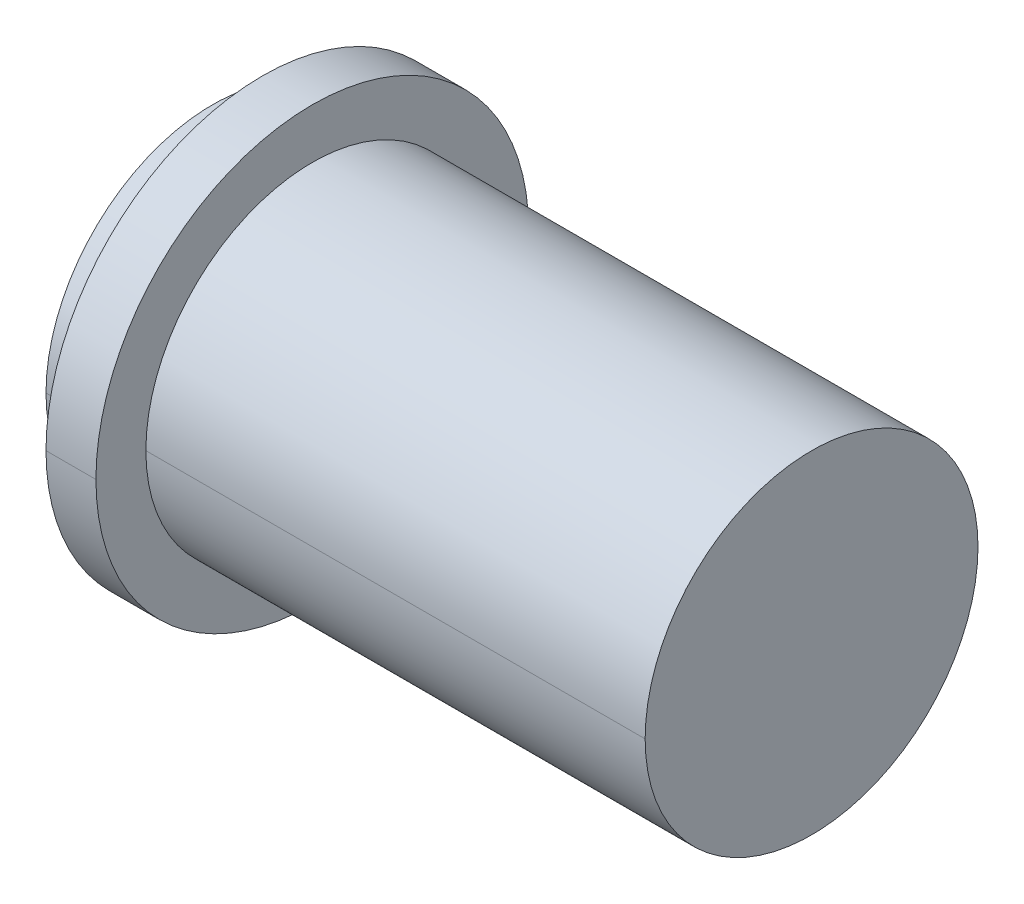
ISO-10303-21;
HEADER;
FILE_DESCRIPTION(('STEP AP214'),'2;1');
FILE_NAME('part.step','',(''),(''),'','','');
FILE_SCHEMA(('AUTOMOTIVE_DESIGN { 1 0 10303 214 1 1 1 1 }'));
ENDSEC;
DATA;
#1=APPLICATION_CONTEXT('core data for automotive mechanical design processes');
#2=APPLICATION_PROTOCOL_DEFINITION('international standard','automotive_design',2000,#1);
#3=PRODUCT_CONTEXT('',#1,'mechanical');
#4=PRODUCT('Part','Part','',(#3));
#5=PRODUCT_RELATED_PRODUCT_CATEGORY('part','',(#4));
#6=PRODUCT_DEFINITION_FORMATION('','',#4);
#7=PRODUCT_DEFINITION_CONTEXT('part definition',#1,'design');
#8=PRODUCT_DEFINITION('design','',#6,#7);
#9=PRODUCT_DEFINITION_SHAPE('','',#8);
#10=(LENGTH_UNIT() NAMED_UNIT(*) SI_UNIT(.MILLI.,.METRE.));
#11=(NAMED_UNIT(*) PLANE_ANGLE_UNIT() SI_UNIT($,.RADIAN.));
#12=(NAMED_UNIT(*) SI_UNIT($,.STERADIAN.) SOLID_ANGLE_UNIT());
#13=UNCERTAINTY_MEASURE_WITH_UNIT(LENGTH_MEASURE(1.E-05),#10,'distance_accuracy_value','');
#14=(GEOMETRIC_REPRESENTATION_CONTEXT(3) GLOBAL_UNCERTAINTY_ASSIGNED_CONTEXT((#13)) GLOBAL_UNIT_ASSIGNED_CONTEXT((#10,
#11,#12)) REPRESENTATION_CONTEXT('',''));
#15=CARTESIAN_POINT('',(0.,0.,0.));
#16=DIRECTION('',(0.,0.,1.));
#17=DIRECTION('',(1.,0.,0.));
#18=AXIS2_PLACEMENT_3D('',#15,#16,#17);
#19=CARTESIAN_POINT('',(0.,0.,0.));
#20=DIRECTION('',(-1.,0.,0.));
#21=DIRECTION('',(0.,0.,1.));
#22=AXIS2_PLACEMENT_3D('',#19,#20,#21);
#23=CYLINDRICAL_SURFACE('',#22,10.);
#24=DIRECTION('',(-1.,0.,0.));
#25=VECTOR('',#24,1.);
#26=CARTESIAN_POINT('',(0.,0.,-10.));
#27=LINE('',#26,#25);
#28=CARTESIAN_POINT('',(1.,0.,-10.));
#29=VERTEX_POINT('',#28);
#30=CARTESIAN_POINT('',(0.,0.,-10.));
#31=VERTEX_POINT('',#30);
#32=EDGE_CURVE('E210',#29,#31,#27,.T.);
#33=ORIENTED_EDGE('',*,*,#32,.F.);
#34=CARTESIAN_POINT('',(1.,0.,0.));
#35=DIRECTION('',(-1.,0.,0.));
#36=DIRECTION('',(0.,0.,1.));
#37=AXIS2_PLACEMENT_3D('',#34,#35,#36);
#38=CIRCLE('',#37,10.);
#39=CARTESIAN_POINT('',(1.,0.,10.));
#40=VERTEX_POINT('',#39);
#41=EDGE_CURVE('E11',#29,#40,#38,.T.);
#42=ORIENTED_EDGE('',*,*,#41,.T.);
#43=DIRECTION('',(-1.,0.,0.));
#44=VECTOR('',#43,1.);
#45=CARTESIAN_POINT('',(0.,0.,10.));
#46=LINE('',#45,#44);
#47=CARTESIAN_POINT('',(0.,0.,10.));
#48=VERTEX_POINT('',#47);
#49=EDGE_CURVE('E178',#40,#48,#46,.T.);
#50=ORIENTED_EDGE('',*,*,#49,.T.);
#51=CARTESIAN_POINT('',(0.,0.,0.));
#52=DIRECTION('',(-1.,0.,0.));
#53=DIRECTION('',(0.,0.,1.));
#54=AXIS2_PLACEMENT_3D('',#51,#52,#53);
#55=CIRCLE('',#54,10.);
#56=EDGE_CURVE('E183',#31,#48,#55,.T.);
#57=ORIENTED_EDGE('',*,*,#56,.F.);
#58=EDGE_LOOP('',(#33,#42,#50,#57));
#59=FACE_BOUND('',#58,.T.);
#60=ADVANCED_FACE('F17',(#59),#23,.T.);
#61=CARTESIAN_POINT('',(1.,10.,0.));
#62=DIRECTION('',(-1.,0.,0.));
#63=DIRECTION('',(0.,0.,1.));
#64=AXIS2_PLACEMENT_3D('',#61,#62,#63);
#65=PLANE('',#64);
#66=CARTESIAN_POINT('',(1.,0.,0.));
#67=DIRECTION('',(-1.,0.,0.));
#68=DIRECTION('',(0.,0.,1.));
#69=AXIS2_PLACEMENT_3D('',#66,#67,#68);
#70=CIRCLE('',#69,9.);
#71=CARTESIAN_POINT('',(1.,0.,9.));
#72=VERTEX_POINT('',#71);
#73=CARTESIAN_POINT('',(1.,0.,-9.));
#74=VERTEX_POINT('',#73);
#75=EDGE_CURVE('E182',#72,#74,#70,.T.);
#76=ORIENTED_EDGE('',*,*,#75,.T.);
#77=CARTESIAN_POINT('',(1.,0.,0.));
#78=DIRECTION('',(-1.,0.,0.));
#79=DIRECTION('',(0.,0.,1.));
#80=AXIS2_PLACEMENT_3D('',#77,#78,#79);
#81=CIRCLE('',#80,9.);
#82=EDGE_CURVE('E27',#74,#72,#81,.T.);
#83=ORIENTED_EDGE('',*,*,#82,.T.);
#84=EDGE_LOOP('',(#76,#83));
#85=FACE_BOUND('',#84,.T.);
#86=CARTESIAN_POINT('',(1.,0.,0.));
#87=DIRECTION('',(-1.,0.,0.));
#88=DIRECTION('',(0.,0.,1.));
#89=AXIS2_PLACEMENT_3D('',#86,#87,#88);
#90=CIRCLE('',#89,10.);
#91=EDGE_CURVE('E207',#40,#29,#90,.T.);
#92=ORIENTED_EDGE('',*,*,#91,.F.);
#93=ORIENTED_EDGE('',*,*,#41,.F.);
#94=EDGE_LOOP('',(#92,#93));
#95=FACE_BOUND('',#94,.T.);
#96=ADVANCED_FACE('F286',(#85,#95),#65,.F.);
#97=CARTESIAN_POINT('',(0.,0.,0.));
#98=DIRECTION('',(-1.,0.,0.));
#99=DIRECTION('',(0.,0.,1.));
#100=AXIS2_PLACEMENT_3D('',#97,#98,#99);
#101=CYLINDRICAL_SURFACE('',#100,9.);
#102=DIRECTION('',(-1.,0.,0.));
#103=VECTOR('',#102,1.);
#104=CARTESIAN_POINT('',(0.,0.,-9.));
#105=LINE('',#104,#103);
#106=CARTESIAN_POINT('',(2.,0.,-9.));
#107=VERTEX_POINT('',#106);
#108=EDGE_CURVE('E177',#107,#74,#105,.T.);
#109=ORIENTED_EDGE('',*,*,#108,.F.);
#110=CARTESIAN_POINT('',(2.,0.,0.));
#111=DIRECTION('',(-1.,0.,0.));
#112=DIRECTION('',(0.,0.,1.));
#113=AXIS2_PLACEMENT_3D('',#110,#111,#112);
#114=CIRCLE('',#113,9.);
#115=CARTESIAN_POINT('',(2.,0.,9.));
#116=VERTEX_POINT('',#115);
#117=EDGE_CURVE('E116',#107,#116,#114,.T.);
#118=ORIENTED_EDGE('',*,*,#117,.T.);
#119=DIRECTION('',(-1.,0.,0.));
#120=VECTOR('',#119,1.);
#121=CARTESIAN_POINT('',(0.,0.,9.));
#122=LINE('',#121,#120);
#123=EDGE_CURVE('E190',#116,#72,#122,.T.);
#124=ORIENTED_EDGE('',*,*,#123,.T.);
#125=ORIENTED_EDGE('',*,*,#82,.F.);
#126=EDGE_LOOP('',(#109,#118,#124,#125));
#127=FACE_BOUND('',#126,.T.);
#128=ADVANCED_FACE('F291',(#127),#101,.T.);
#129=CARTESIAN_POINT('',(2.,9.,0.));
#130=DIRECTION('',(1.,0.,0.));
#131=DIRECTION('',(0.,1.,0.));
#132=AXIS2_PLACEMENT_3D('',#129,#130,#131);
#133=PLANE('',#132);
#134=CARTESIAN_POINT('',(2.,0.,0.));
#135=DIRECTION('',(-1.,0.,0.));
#136=DIRECTION('',(0.,0.,1.));
#137=AXIS2_PLACEMENT_3D('',#134,#135,#136);
#138=CIRCLE('',#137,9.);
#139=EDGE_CURVE('E174',#116,#107,#138,.T.);
#140=ORIENTED_EDGE('',*,*,#139,.F.);
#141=ORIENTED_EDGE('',*,*,#117,.F.);
#142=EDGE_LOOP('',(#140,#141));
#143=FACE_BOUND('',#142,.T.);
#144=CARTESIAN_POINT('',(2.,0.,0.));
#145=DIRECTION('',(-1.,0.,0.));
#146=DIRECTION('',(0.,0.,1.));
#147=AXIS2_PLACEMENT_3D('',#144,#145,#146);
#148=CIRCLE('',#147,10.);
#149=CARTESIAN_POINT('',(2.,0.,10.));
#150=VERTEX_POINT('',#149);
#151=CARTESIAN_POINT('',(2.,0.,-10.));
#152=VERTEX_POINT('',#151);
#153=EDGE_CURVE('E149',#150,#152,#148,.T.);
#154=ORIENTED_EDGE('',*,*,#153,.T.);
#155=CARTESIAN_POINT('',(2.,0.,0.));
#156=DIRECTION('',(-1.,0.,0.));
#157=DIRECTION('',(0.,0.,1.));
#158=AXIS2_PLACEMENT_3D('',#155,#156,#157);
#159=CIRCLE('',#158,10.);
#160=EDGE_CURVE('E142',#152,#150,#159,.T.);
#161=ORIENTED_EDGE('',*,*,#160,.T.);
#162=EDGE_LOOP('',(#154,#161));
#163=FACE_BOUND('',#162,.T.);
#164=ADVANCED_FACE('F147',(#143,#163),#133,.F.);
#165=CARTESIAN_POINT('',(0.,0.,0.));
#166=DIRECTION('',(-1.,0.,0.));
#167=DIRECTION('',(0.,0.,1.));
#168=AXIS2_PLACEMENT_3D('',#165,#166,#167);
#169=CYLINDRICAL_SURFACE('',#168,10.);
#170=DIRECTION('',(-1.,0.,0.));
#171=VECTOR('',#170,1.);
#172=CARTESIAN_POINT('',(0.,0.,-10.));
#173=LINE('',#172,#171);
#174=CARTESIAN_POINT('',(3.,0.,-10.));
#175=VERTEX_POINT('',#174);
#176=EDGE_CURVE('E164',#175,#152,#173,.T.);
#177=ORIENTED_EDGE('',*,*,#176,.F.);
#178=CARTESIAN_POINT('',(3.,0.,0.));
#179=DIRECTION('',(-1.,0.,0.));
#180=DIRECTION('',(0.,0.,1.));
#181=AXIS2_PLACEMENT_3D('',#178,#179,#180);
#182=CIRCLE('',#181,10.);
#183=CARTESIAN_POINT('',(3.,0.,10.));
#184=VERTEX_POINT('',#183);
#185=EDGE_CURVE('E152',#175,#184,#182,.T.);
#186=ORIENTED_EDGE('',*,*,#185,.T.);
#187=DIRECTION('',(-1.,0.,0.));
#188=VECTOR('',#187,1.);
#189=CARTESIAN_POINT('',(0.,0.,10.));
#190=LINE('',#189,#188);
#191=EDGE_CURVE('E155',#184,#150,#190,.T.);
#192=ORIENTED_EDGE('',*,*,#191,.T.);
#193=ORIENTED_EDGE('',*,*,#160,.F.);
#194=EDGE_LOOP('',(#177,#186,#192,#193));
#195=FACE_BOUND('',#194,.T.);
#196=ADVANCED_FACE('F156',(#195),#169,.T.);
#197=CARTESIAN_POINT('',(3.,13.,0.));
#198=DIRECTION('',(1.,0.,0.));
#199=DIRECTION('',(0.,1.,0.));
#200=AXIS2_PLACEMENT_3D('',#197,#198,#199);
#201=PLANE('',#200);
#202=CARTESIAN_POINT('',(3.,0.,0.));
#203=DIRECTION('',(-1.,0.,0.));
#204=DIRECTION('',(0.,0.,1.));
#205=AXIS2_PLACEMENT_3D('',#202,#203,#204);
#206=CIRCLE('',#205,10.);
#207=EDGE_CURVE('E171',#184,#175,#206,.T.);
#208=ORIENTED_EDGE('',*,*,#207,.F.);
#209=ORIENTED_EDGE('',*,*,#185,.F.);
#210=EDGE_LOOP('',(#208,#209));
#211=FACE_BOUND('',#210,.T.);
#212=CARTESIAN_POINT('',(3.,0.,0.));
#213=DIRECTION('',(-1.,0.,0.));
#214=DIRECTION('',(0.,0.,1.));
#215=AXIS2_PLACEMENT_3D('',#212,#213,#214);
#216=CIRCLE('',#215,13.);
#217=CARTESIAN_POINT('',(3.,0.,13.));
#218=VERTEX_POINT('',#217);
#219=CARTESIAN_POINT('',(3.,0.,-13.));
#220=VERTEX_POINT('',#219);
#221=EDGE_CURVE('E226',#218,#220,#216,.T.);
#222=ORIENTED_EDGE('',*,*,#221,.T.);
#223=CARTESIAN_POINT('',(3.,0.,0.));
#224=DIRECTION('',(-1.,0.,0.));
#225=DIRECTION('',(0.,0.,1.));
#226=AXIS2_PLACEMENT_3D('',#223,#224,#225);
#227=CIRCLE('',#226,13.);
#228=EDGE_CURVE('E71',#220,#218,#227,.T.);
#229=ORIENTED_EDGE('',*,*,#228,.T.);
#230=EDGE_LOOP('',(#222,#229));
#231=FACE_BOUND('',#230,.T.);
#232=ADVANCED_FACE('F271',(#211,#231),#201,.F.);
#233=CARTESIAN_POINT('',(0.,0.,0.));
#234=DIRECTION('',(-1.,0.,0.));
#235=DIRECTION('',(0.,0.,1.));
#236=AXIS2_PLACEMENT_3D('',#233,#234,#235);
#237=CYLINDRICAL_SURFACE('',#236,13.);
#238=DIRECTION('',(-1.,0.,0.));
#239=VECTOR('',#238,1.);
#240=CARTESIAN_POINT('',(0.,0.,-13.));
#241=LINE('',#240,#239);
#242=CARTESIAN_POINT('',(6.,0.,-13.));
#243=VERTEX_POINT('',#242);
#244=EDGE_CURVE('E223',#243,#220,#241,.T.);
#245=ORIENTED_EDGE('',*,*,#244,.F.);
#246=CARTESIAN_POINT('',(6.,0.,0.));
#247=DIRECTION('',(-1.,0.,0.));
#248=DIRECTION('',(0.,0.,1.));
#249=AXIS2_PLACEMENT_3D('',#246,#247,#248);
#250=CIRCLE('',#249,13.);
#251=CARTESIAN_POINT('',(6.,0.,13.));
#252=VERTEX_POINT('',#251);
#253=EDGE_CURVE('E58',#243,#252,#250,.T.);
#254=ORIENTED_EDGE('',*,*,#253,.T.);
#255=DIRECTION('',(-1.,0.,0.));
#256=VECTOR('',#255,1.);
#257=CARTESIAN_POINT('',(0.,0.,13.));
#258=LINE('',#257,#256);
#259=EDGE_CURVE('E205',#252,#218,#258,.T.);
#260=ORIENTED_EDGE('',*,*,#259,.T.);
#261=ORIENTED_EDGE('',*,*,#228,.F.);
#262=EDGE_LOOP('',(#245,#254,#260,#261));
#263=FACE_BOUND('',#262,.T.);
#264=ADVANCED_FACE('F267',(#263),#237,.T.);
#265=CARTESIAN_POINT('',(6.,13.,0.));
#266=DIRECTION('',(-1.,0.,0.));
#267=DIRECTION('',(0.,0.,1.));
#268=AXIS2_PLACEMENT_3D('',#265,#266,#267);
#269=PLANE('',#268);
#270=CARTESIAN_POINT('',(6.,0.,0.));
#271=DIRECTION('',(-1.,0.,0.));
#272=DIRECTION('',(0.,0.,1.));
#273=AXIS2_PLACEMENT_3D('',#270,#271,#272);
#274=CIRCLE('',#273,10.);
#275=CARTESIAN_POINT('',(6.,0.,10.));
#276=VERTEX_POINT('',#275);
#277=CARTESIAN_POINT('',(6.,0.,-10.));
#278=VERTEX_POINT('',#277);
#279=EDGE_CURVE('E219',#276,#278,#274,.T.);
#280=ORIENTED_EDGE('',*,*,#279,.T.);
#281=CARTESIAN_POINT('',(6.,0.,0.));
#282=DIRECTION('',(-1.,0.,0.));
#283=DIRECTION('',(0.,0.,1.));
#284=AXIS2_PLACEMENT_3D('',#281,#282,#283);
#285=CIRCLE('',#284,10.);
#286=EDGE_CURVE('E40',#278,#276,#285,.T.);
#287=ORIENTED_EDGE('',*,*,#286,.T.);
#288=EDGE_LOOP('',(#280,#287));
#289=FACE_BOUND('',#288,.T.);
#290=CARTESIAN_POINT('',(6.,0.,0.));
#291=DIRECTION('',(-1.,0.,0.));
#292=DIRECTION('',(0.,0.,1.));
#293=AXIS2_PLACEMENT_3D('',#290,#291,#292);
#294=CIRCLE('',#293,13.);
#295=EDGE_CURVE('E161',#252,#243,#294,.T.);
#296=ORIENTED_EDGE('',*,*,#295,.F.);
#297=ORIENTED_EDGE('',*,*,#253,.F.);
#298=EDGE_LOOP('',(#296,#297));
#299=FACE_BOUND('',#298,.T.);
#300=ADVANCED_FACE('F280',(#289,#299),#269,.F.);
#301=CARTESIAN_POINT('',(0.,0.,0.));
#302=DIRECTION('',(-1.,0.,0.));
#303=DIRECTION('',(0.,0.,1.));
#304=AXIS2_PLACEMENT_3D('',#301,#302,#303);
#305=CYLINDRICAL_SURFACE('',#304,10.);
#306=DIRECTION('',(-1.,0.,0.));
#307=VECTOR('',#306,1.);
#308=CARTESIAN_POINT('',(0.,0.,-10.));
#309=LINE('',#308,#307);
#310=CARTESIAN_POINT('',(36.,0.,-10.));
#311=VERTEX_POINT('',#310);
#312=EDGE_CURVE('E215',#311,#278,#309,.T.);
#313=ORIENTED_EDGE('',*,*,#312,.F.);
#314=CARTESIAN_POINT('',(36.,0.,0.));
#315=DIRECTION('',(-1.,0.,0.));
#316=DIRECTION('',(0.,0.,1.));
#317=AXIS2_PLACEMENT_3D('',#314,#315,#316);
#318=CIRCLE('',#317,10.);
#319=CARTESIAN_POINT('',(36.,0.,10.));
#320=VERTEX_POINT('',#319);
#321=EDGE_CURVE('E186',#311,#320,#318,.T.);
#322=ORIENTED_EDGE('',*,*,#321,.T.);
#323=DIRECTION('',(-1.,0.,0.));
#324=VECTOR('',#323,1.);
#325=CARTESIAN_POINT('',(0.,0.,10.));
#326=LINE('',#325,#324);
#327=EDGE_CURVE('E187',#320,#276,#326,.T.);
#328=ORIENTED_EDGE('',*,*,#327,.T.);
#329=ORIENTED_EDGE('',*,*,#286,.F.);
#330=EDGE_LOOP('',(#313,#322,#328,#329));
#331=FACE_BOUND('',#330,.T.);
#332=ADVANCED_FACE('F19',(#331),#305,.T.);
#333=CARTESIAN_POINT('',(36.,0.,0.));
#334=DIRECTION('',(-1.,0.,0.));
#335=DIRECTION('',(0.,0.,1.));
#336=AXIS2_PLACEMENT_3D('',#333,#334,#335);
#337=PLANE('',#336);
#338=CARTESIAN_POINT('',(36.,0.,0.));
#339=DIRECTION('',(-1.,0.,0.));
#340=DIRECTION('',(0.,0.,1.));
#341=AXIS2_PLACEMENT_3D('',#338,#339,#340);
#342=CIRCLE('',#341,10.);
#343=EDGE_CURVE('E220',#320,#311,#342,.T.);
#344=ORIENTED_EDGE('',*,*,#343,.F.);
#345=ORIENTED_EDGE('',*,*,#321,.F.);
#346=EDGE_LOOP('',(#344,#345));
#347=FACE_BOUND('',#346,.T.);
#348=ADVANCED_FACE('F305',(#347),#337,.F.);
#349=CARTESIAN_POINT('',(0.,10.,0.));
#350=DIRECTION('',(1.,0.,0.));
#351=DIRECTION('',(0.,1.,0.));
#352=AXIS2_PLACEMENT_3D('',#349,#350,#351);
#353=PLANE('',#352);
#354=CARTESIAN_POINT('',(0.,0.,0.));
#355=DIRECTION('',(-1.,0.,0.));
#356=DIRECTION('',(0.,0.,1.));
#357=AXIS2_PLACEMENT_3D('',#354,#355,#356);
#358=CIRCLE('',#357,10.);
#359=EDGE_CURVE('E231',#48,#31,#358,.T.);
#360=ORIENTED_EDGE('',*,*,#359,.T.);
#361=ORIENTED_EDGE('',*,*,#56,.T.);
#362=EDGE_LOOP('',(#360,#361));
#363=FACE_BOUND('',#362,.T.);
#364=ADVANCED_FACE('F308',(#363),#353,.F.);
#365=CARTESIAN_POINT('',(0.,0.,0.));
#366=DIRECTION('',(-1.,0.,0.));
#367=DIRECTION('',(0.,0.,1.));
#368=AXIS2_PLACEMENT_3D('',#365,#366,#367);
#369=CYLINDRICAL_SURFACE('',#368,10.);
#370=ORIENTED_EDGE('',*,*,#343,.T.);
#371=ORIENTED_EDGE('',*,*,#312,.T.);
#372=ORIENTED_EDGE('',*,*,#279,.F.);
#373=ORIENTED_EDGE('',*,*,#327,.F.);
#374=EDGE_LOOP('',(#370,#371,#372,#373));
#375=FACE_BOUND('',#374,.T.);
#376=ADVANCED_FACE('F299',(#375),#369,.T.);
#377=CARTESIAN_POINT('',(0.,0.,0.));
#378=DIRECTION('',(-1.,0.,0.));
#379=DIRECTION('',(0.,0.,1.));
#380=AXIS2_PLACEMENT_3D('',#377,#378,#379);
#381=CYLINDRICAL_SURFACE('',#380,13.);
#382=ORIENTED_EDGE('',*,*,#295,.T.);
#383=ORIENTED_EDGE('',*,*,#244,.T.);
#384=ORIENTED_EDGE('',*,*,#221,.F.);
#385=ORIENTED_EDGE('',*,*,#259,.F.);
#386=EDGE_LOOP('',(#382,#383,#384,#385));
#387=FACE_BOUND('',#386,.T.);
#388=ADVANCED_FACE('F269',(#387),#381,.T.);
#389=CARTESIAN_POINT('',(0.,0.,0.));
#390=DIRECTION('',(-1.,0.,0.));
#391=DIRECTION('',(0.,0.,1.));
#392=AXIS2_PLACEMENT_3D('',#389,#390,#391);
#393=CYLINDRICAL_SURFACE('',#392,10.);
#394=ORIENTED_EDGE('',*,*,#207,.T.);
#395=ORIENTED_EDGE('',*,*,#176,.T.);
#396=ORIENTED_EDGE('',*,*,#153,.F.);
#397=ORIENTED_EDGE('',*,*,#191,.F.);
#398=EDGE_LOOP('',(#394,#395,#396,#397));
#399=FACE_BOUND('',#398,.T.);
#400=ADVANCED_FACE('F163',(#399),#393,.T.);
#401=CARTESIAN_POINT('',(0.,0.,0.));
#402=DIRECTION('',(-1.,0.,0.));
#403=DIRECTION('',(0.,0.,1.));
#404=AXIS2_PLACEMENT_3D('',#401,#402,#403);
#405=CYLINDRICAL_SURFACE('',#404,9.);
#406=ORIENTED_EDGE('',*,*,#139,.T.);
#407=ORIENTED_EDGE('',*,*,#108,.T.);
#408=ORIENTED_EDGE('',*,*,#75,.F.);
#409=ORIENTED_EDGE('',*,*,#123,.F.);
#410=EDGE_LOOP('',(#406,#407,#408,#409));
#411=FACE_BOUND('',#410,.T.);
#412=ADVANCED_FACE('F303',(#411),#405,.T.);
#413=CARTESIAN_POINT('',(0.,0.,0.));
#414=DIRECTION('',(-1.,0.,0.));
#415=DIRECTION('',(0.,0.,1.));
#416=AXIS2_PLACEMENT_3D('',#413,#414,#415);
#417=CYLINDRICAL_SURFACE('',#416,10.);
#418=ORIENTED_EDGE('',*,*,#91,.T.);
#419=ORIENTED_EDGE('',*,*,#32,.T.);
#420=ORIENTED_EDGE('',*,*,#359,.F.);
#421=ORIENTED_EDGE('',*,*,#49,.F.);
#422=EDGE_LOOP('',(#418,#419,#420,#421));
#423=FACE_BOUND('',#422,.T.);
#424=ADVANCED_FACE('F300',(#423),#417,.T.);
#425=CLOSED_SHELL('',(#60,#96,#128,#164,#196,#232,#264,#300,#332,#348,#364,#376,#388,#400,#412,#424));
#426=MANIFOLD_SOLID_BREP('B1',#425);
#427=ADVANCED_BREP_SHAPE_REPRESENTATION('',(#18,#426),#14);
#428=SHAPE_DEFINITION_REPRESENTATION(#9,#427);
ENDSEC;
END-ISO-10303-21;
